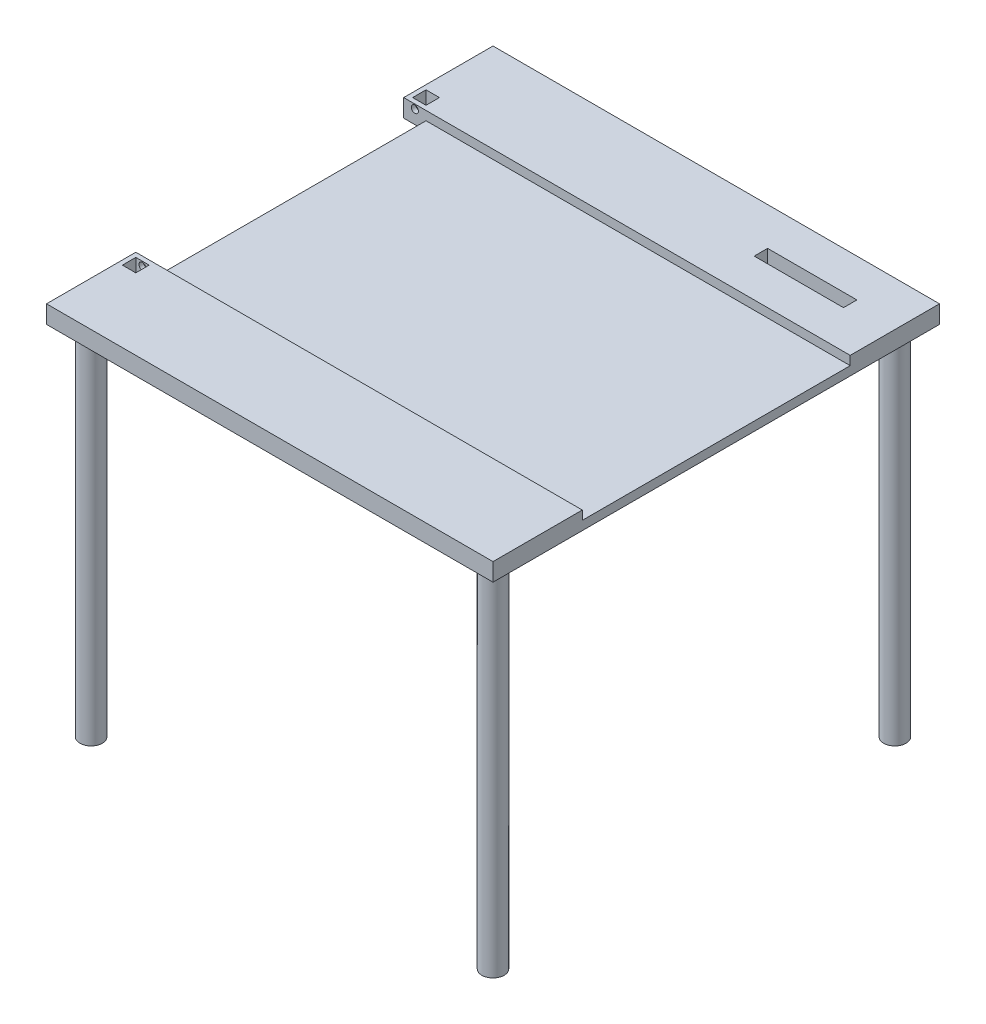
ISO-10303-21;
HEADER;
FILE_DESCRIPTION(('STEP AP214'),'2;1');
FILE_NAME('part.step','',(''),(''),'','','');
FILE_SCHEMA(('AUTOMOTIVE_DESIGN { 1 0 10303 214 1 1 1 1 }'));
ENDSEC;
DATA;
#1=APPLICATION_CONTEXT('core data for automotive mechanical design processes');
#2=APPLICATION_PROTOCOL_DEFINITION('international standard','automotive_design',2000,#1);
#3=PRODUCT_CONTEXT('',#1,'mechanical');
#4=PRODUCT('Part','Part','',(#3));
#5=PRODUCT_RELATED_PRODUCT_CATEGORY('part','',(#4));
#6=PRODUCT_DEFINITION_FORMATION('','',#4);
#7=PRODUCT_DEFINITION_CONTEXT('part definition',#1,'design');
#8=PRODUCT_DEFINITION('design','',#6,#7);
#9=PRODUCT_DEFINITION_SHAPE('','',#8);
#10=(LENGTH_UNIT() NAMED_UNIT(*) SI_UNIT(.MILLI.,.METRE.));
#11=(NAMED_UNIT(*) PLANE_ANGLE_UNIT() SI_UNIT($,.RADIAN.));
#12=(NAMED_UNIT(*) SI_UNIT($,.STERADIAN.) SOLID_ANGLE_UNIT());
#13=UNCERTAINTY_MEASURE_WITH_UNIT(LENGTH_MEASURE(1.E-05),#10,'distance_accuracy_value','');
#14=(GEOMETRIC_REPRESENTATION_CONTEXT(3) GLOBAL_UNCERTAINTY_ASSIGNED_CONTEXT((#13)) GLOBAL_UNIT_ASSIGNED_CONTEXT((#10,
#11,#12)) REPRESENTATION_CONTEXT('',''));
#15=CARTESIAN_POINT('',(0.,0.,0.));
#16=DIRECTION('',(0.,0.,1.));
#17=DIRECTION('',(1.,0.,0.));
#18=AXIS2_PLACEMENT_3D('',#15,#16,#17);
#19=CARTESIAN_POINT('',(0.,40.,0.));
#20=DIRECTION('',(0.,-1.,0.));
#21=DIRECTION('',(0.,0.,-1.));
#22=AXIS2_PLACEMENT_3D('',#19,#20,#21);
#23=PLANE('',#22);
#24=DIRECTION('',(0.,0.,1.));
#25=VECTOR('',#24,1.);
#26=CARTESIAN_POINT('',(2.22044604925031E-13,40.,1000.));
#27=LINE('',#26,#25);
#28=CARTESIAN_POINT('',(0.,40.,0.));
#29=VERTEX_POINT('',#28);
#30=CARTESIAN_POINT('',(0.,40.,200.));
#31=VERTEX_POINT('',#30);
#32=EDGE_CURVE('E333',#29,#31,#27,.T.);
#33=ORIENTED_EDGE('',*,*,#32,.T.);
#34=DIRECTION('',(-1.,0.,0.));
#35=VECTOR('',#34,1.);
#36=CARTESIAN_POINT('',(1000.,40.,200.));
#37=LINE('',#36,#35);
#38=CARTESIAN_POINT('',(1000.,40.,200.));
#39=VERTEX_POINT('',#38);
#40=EDGE_CURVE('E315',#39,#31,#37,.T.);
#41=ORIENTED_EDGE('',*,*,#40,.F.);
#42=DIRECTION('',(0.,0.,-1.));
#43=VECTOR('',#42,1.);
#44=CARTESIAN_POINT('',(1000.,40.,0.));
#45=LINE('',#44,#43);
#46=CARTESIAN_POINT('',(1000.,40.,0.));
#47=VERTEX_POINT('',#46);
#48=EDGE_CURVE('E339',#39,#47,#45,.T.);
#49=ORIENTED_EDGE('',*,*,#48,.T.);
#50=DIRECTION('',(-1.,0.,0.));
#51=VECTOR('',#50,1.);
#52=CARTESIAN_POINT('',(0.,40.,0.));
#53=LINE('',#52,#51);
#54=EDGE_CURVE('E343',#47,#29,#53,.T.);
#55=ORIENTED_EDGE('',*,*,#54,.T.);
#56=EDGE_LOOP('',(#33,#41,#49,#55));
#57=FACE_BOUND('',#56,.T.);
#58=DIRECTION('',(-1.,0.,0.));
#59=VECTOR('',#58,1.);
#60=CARTESIAN_POINT('',(0.,40.,160.));
#61=LINE('',#60,#59);
#62=CARTESIAN_POINT('',(40.,40.,160.));
#63=VERTEX_POINT('',#62);
#64=CARTESIAN_POINT('',(10.,40.,160.));
#65=VERTEX_POINT('',#64);
#66=EDGE_CURVE('E250',#63,#65,#61,.T.);
#67=ORIENTED_EDGE('',*,*,#66,.F.);
#68=DIRECTION('',(0.,0.,-1.));
#69=VECTOR('',#68,1.);
#70=CARTESIAN_POINT('',(40.,40.,0.));
#71=LINE('',#70,#69);
#72=CARTESIAN_POINT('',(40.,40.,190.));
#73=VERTEX_POINT('',#72);
#74=EDGE_CURVE('E64',#73,#63,#71,.T.);
#75=ORIENTED_EDGE('',*,*,#74,.F.);
#76=DIRECTION('',(1.,0.,0.));
#77=VECTOR('',#76,1.);
#78=CARTESIAN_POINT('',(0.,40.,190.));
#79=LINE('',#78,#77);
#80=CARTESIAN_POINT('',(10.,40.,190.));
#81=VERTEX_POINT('',#80);
#82=EDGE_CURVE('E257',#81,#73,#79,.T.);
#83=ORIENTED_EDGE('',*,*,#82,.F.);
#84=DIRECTION('',(0.,0.,1.));
#85=VECTOR('',#84,1.);
#86=CARTESIAN_POINT('',(10.,40.,0.));
#87=LINE('',#86,#85);
#88=EDGE_CURVE('E254',#65,#81,#87,.T.);
#89=ORIENTED_EDGE('',*,*,#88,.F.);
#90=EDGE_LOOP('',(#67,#75,#83,#89));
#91=FACE_BOUND('',#90,.T.);
#92=DIRECTION('',(0.,0.,-1.));
#93=VECTOR('',#92,1.);
#94=CARTESIAN_POINT('',(700.000000000003,40.,0.));
#95=LINE('',#94,#93);
#96=CARTESIAN_POINT('',(700.000000000003,40.,115.));
#97=VERTEX_POINT('',#96);
#98=CARTESIAN_POINT('',(700.000000000003,40.,85.0000000000002));
#99=VERTEX_POINT('',#98);
#100=EDGE_CURVE('E56',#97,#99,#95,.T.);
#101=ORIENTED_EDGE('',*,*,#100,.T.);
#102=DIRECTION('',(-1.,0.,0.));
#103=VECTOR('',#102,1.);
#104=CARTESIAN_POINT('',(0.,40.,85.0000000000002));
#105=LINE('',#104,#103);
#106=CARTESIAN_POINT('',(900.,40.,85.0000000000002));
#107=VERTEX_POINT('',#106);
#108=EDGE_CURVE('E206',#107,#99,#105,.T.);
#109=ORIENTED_EDGE('',*,*,#108,.F.);
#110=DIRECTION('',(0.,0.,-1.));
#111=VECTOR('',#110,1.);
#112=CARTESIAN_POINT('',(900.,40.,0.));
#113=LINE('',#112,#111);
#114=CARTESIAN_POINT('',(900.,40.,115.));
#115=VERTEX_POINT('',#114);
#116=EDGE_CURVE('E218',#115,#107,#113,.T.);
#117=ORIENTED_EDGE('',*,*,#116,.F.);
#118=DIRECTION('',(1.,0.,0.));
#119=VECTOR('',#118,1.);
#120=CARTESIAN_POINT('',(0.,40.,115.));
#121=LINE('',#120,#119);
#122=EDGE_CURVE('E216',#97,#115,#121,.T.);
#123=ORIENTED_EDGE('',*,*,#122,.F.);
#124=EDGE_LOOP('',(#101,#109,#117,#123));
#125=FACE_BOUND('',#124,.T.);
#126=ADVANCED_FACE('F39',(#57,#91,#125),#23,.F.);
#127=CARTESIAN_POINT('',(2.22044604925031E-13,40.,1000.));
#128=DIRECTION('',(1.,0.,0.));
#129=DIRECTION('',(0.,0.,-1.));
#130=AXIS2_PLACEMENT_3D('',#127,#128,#129);
#131=PLANE('',#130);
#132=DIRECTION('',(0.,0.,1.));
#133=VECTOR('',#132,1.);
#134=CARTESIAN_POINT('',(2.22044604925031E-13,0.,1000.));
#135=LINE('',#134,#133);
#136=CARTESIAN_POINT('',(0.,0.,0.));
#137=VERTEX_POINT('',#136);
#138=CARTESIAN_POINT('',(0.,0.,200.));
#139=VERTEX_POINT('',#138);
#140=EDGE_CURVE('E346',#137,#139,#135,.T.);
#141=ORIENTED_EDGE('',*,*,#140,.T.);
#142=DIRECTION('',(0.,1.,0.));
#143=VECTOR('',#142,1.);
#144=CARTESIAN_POINT('',(0.,20.,200.));
#145=LINE('',#144,#143);
#146=EDGE_CURVE('E323',#139,#31,#145,.T.);
#147=ORIENTED_EDGE('',*,*,#146,.T.);
#148=ORIENTED_EDGE('',*,*,#32,.F.);
#149=DIRECTION('',(0.,-1.,0.));
#150=VECTOR('',#149,1.);
#151=CARTESIAN_POINT('',(0.,40.,0.));
#152=LINE('',#151,#150);
#153=EDGE_CURVE('E345',#29,#137,#152,.T.);
#154=ORIENTED_EDGE('',*,*,#153,.T.);
#155=EDGE_LOOP('',(#141,#147,#148,#154));
#156=FACE_BOUND('',#155,.T.);
#157=ADVANCED_FACE('F404',(#156),#131,.F.);
#158=DIRECTION('',(0.,1.,0.));
#159=VECTOR('',#158,1.);
#160=CARTESIAN_POINT('',(0.,20.,800.));
#161=LINE('',#160,#159);
#162=CARTESIAN_POINT('',(0.,0.,800.));
#163=VERTEX_POINT('',#162);
#164=CARTESIAN_POINT('',(1.77635683940025E-13,40.,800.));
#165=VERTEX_POINT('',#164);
#166=EDGE_CURVE('E320',#163,#165,#161,.T.);
#167=ORIENTED_EDGE('',*,*,#166,.F.);
#168=CARTESIAN_POINT('',(2.22044604925031E-13,0.,1000.));
#169=VERTEX_POINT('',#168);
#170=EDGE_CURVE('E326',#163,#169,#135,.T.);
#171=ORIENTED_EDGE('',*,*,#170,.T.);
#172=DIRECTION('',(0.,-1.,0.));
#173=VECTOR('',#172,1.);
#174=CARTESIAN_POINT('',(2.22044604925031E-13,40.,1000.));
#175=LINE('',#174,#173);
#176=CARTESIAN_POINT('',(2.22044604925031E-13,40.,1000.));
#177=VERTEX_POINT('',#176);
#178=EDGE_CURVE('E363',#177,#169,#175,.T.);
#179=ORIENTED_EDGE('',*,*,#178,.F.);
#180=EDGE_CURVE('E337',#165,#177,#27,.T.);
#181=ORIENTED_EDGE('',*,*,#180,.F.);
#182=EDGE_LOOP('',(#167,#171,#179,#181));
#183=FACE_BOUND('',#182,.T.);
#184=ADVANCED_FACE('F41',(#183),#131,.F.);
#185=CARTESIAN_POINT('',(1000.,40.,1000.));
#186=DIRECTION('',(0.,0.,-1.));
#187=DIRECTION('',(-1.,0.,0.));
#188=AXIS2_PLACEMENT_3D('',#185,#186,#187);
#189=PLANE('',#188);
#190=DIRECTION('',(1.,0.,0.));
#191=VECTOR('',#190,1.);
#192=CARTESIAN_POINT('',(1000.,0.,1000.));
#193=LINE('',#192,#191);
#194=CARTESIAN_POINT('',(1000.,0.,1000.));
#195=VERTEX_POINT('',#194);
#196=EDGE_CURVE('E349',#169,#195,#193,.T.);
#197=ORIENTED_EDGE('',*,*,#196,.T.);
#198=DIRECTION('',(0.,-1.,0.));
#199=VECTOR('',#198,1.);
#200=CARTESIAN_POINT('',(1000.,40.,1000.));
#201=LINE('',#200,#199);
#202=CARTESIAN_POINT('',(1000.,40.,1000.));
#203=VERTEX_POINT('',#202);
#204=EDGE_CURVE('E360',#203,#195,#201,.T.);
#205=ORIENTED_EDGE('',*,*,#204,.F.);
#206=DIRECTION('',(1.,0.,0.));
#207=VECTOR('',#206,1.);
#208=CARTESIAN_POINT('',(1000.,40.,1000.));
#209=LINE('',#208,#207);
#210=EDGE_CURVE('E336',#177,#203,#209,.T.);
#211=ORIENTED_EDGE('',*,*,#210,.F.);
#212=ORIENTED_EDGE('',*,*,#178,.T.);
#213=EDGE_LOOP('',(#197,#205,#211,#212));
#214=FACE_BOUND('',#213,.T.);
#215=ADVANCED_FACE('F453',(#214),#189,.F.);
#216=CARTESIAN_POINT('',(1000.,40.,0.));
#217=DIRECTION('',(-1.,0.,0.));
#218=DIRECTION('',(0.,0.,1.));
#219=AXIS2_PLACEMENT_3D('',#216,#217,#218);
#220=PLANE('',#219);
#221=ORIENTED_EDGE('',*,*,#48,.F.);
#222=DIRECTION('',(0.,1.,0.));
#223=VECTOR('',#222,1.);
#224=CARTESIAN_POINT('',(1000.,20.,200.));
#225=LINE('',#224,#223);
#226=CARTESIAN_POINT('',(1000.,20.,200.));
#227=VERTEX_POINT('',#226);
#228=EDGE_CURVE('E327',#227,#39,#225,.T.);
#229=ORIENTED_EDGE('',*,*,#228,.F.);
#230=DIRECTION('',(0.,0.,-1.));
#231=VECTOR('',#230,1.);
#232=CARTESIAN_POINT('',(1000.,20.,800.));
#233=LINE('',#232,#231);
#234=CARTESIAN_POINT('',(1000.,20.,800.));
#235=VERTEX_POINT('',#234);
#236=EDGE_CURVE('E314',#235,#227,#233,.T.);
#237=ORIENTED_EDGE('',*,*,#236,.F.);
#238=DIRECTION('',(0.,1.,0.));
#239=VECTOR('',#238,1.);
#240=CARTESIAN_POINT('',(1000.,20.,800.));
#241=LINE('',#240,#239);
#242=CARTESIAN_POINT('',(1000.,40.,800.));
#243=VERTEX_POINT('',#242);
#244=EDGE_CURVE('E329',#235,#243,#241,.T.);
#245=ORIENTED_EDGE('',*,*,#244,.T.);
#246=EDGE_CURVE('E340',#203,#243,#45,.T.);
#247=ORIENTED_EDGE('',*,*,#246,.F.);
#248=ORIENTED_EDGE('',*,*,#204,.T.);
#249=DIRECTION('',(0.,0.,-1.));
#250=VECTOR('',#249,1.);
#251=CARTESIAN_POINT('',(1000.,0.,0.));
#252=LINE('',#251,#250);
#253=CARTESIAN_POINT('',(1000.,0.,0.));
#254=VERTEX_POINT('',#253);
#255=EDGE_CURVE('E351',#195,#254,#252,.T.);
#256=ORIENTED_EDGE('',*,*,#255,.T.);
#257=DIRECTION('',(0.,-1.,0.));
#258=VECTOR('',#257,1.);
#259=CARTESIAN_POINT('',(1000.,40.,0.));
#260=LINE('',#259,#258);
#261=EDGE_CURVE('E357',#47,#254,#260,.T.);
#262=ORIENTED_EDGE('',*,*,#261,.F.);
#263=EDGE_LOOP('',(#221,#229,#237,#245,#247,#248,#256,#262));
#264=FACE_BOUND('',#263,.T.);
#265=ADVANCED_FACE('F425',(#264),#220,.F.);
#266=CARTESIAN_POINT('',(0.,40.,0.));
#267=DIRECTION('',(0.,0.,1.));
#268=DIRECTION('',(1.,0.,0.));
#269=AXIS2_PLACEMENT_3D('',#266,#267,#268);
#270=PLANE('',#269);
#271=DIRECTION('',(-1.,0.,0.));
#272=VECTOR('',#271,1.);
#273=CARTESIAN_POINT('',(0.,0.,0.));
#274=LINE('',#273,#272);
#275=EDGE_CURVE('E353',#254,#137,#274,.T.);
#276=ORIENTED_EDGE('',*,*,#275,.T.);
#277=ORIENTED_EDGE('',*,*,#153,.F.);
#278=ORIENTED_EDGE('',*,*,#54,.F.);
#279=ORIENTED_EDGE('',*,*,#261,.T.);
#280=EDGE_LOOP('',(#276,#277,#278,#279));
#281=FACE_BOUND('',#280,.T.);
#282=ADVANCED_FACE('F417',(#281),#270,.F.);
#283=DIRECTION('',(-1.,0.,0.));
#284=VECTOR('',#283,1.);
#285=CARTESIAN_POINT('',(0.,40.,810.));
#286=LINE('',#285,#284);
#287=CARTESIAN_POINT('',(40.0000000000002,40.,810.));
#288=VERTEX_POINT('',#287);
#289=CARTESIAN_POINT('',(10.0000000000002,40.,810.));
#290=VERTEX_POINT('',#289);
#291=EDGE_CURVE('E271',#288,#290,#286,.T.);
#292=ORIENTED_EDGE('',*,*,#291,.F.);
#293=DIRECTION('',(0.,0.,-1.));
#294=VECTOR('',#293,1.);
#295=CARTESIAN_POINT('',(40.0000000000002,40.,0.));
#296=LINE('',#295,#294);
#297=CARTESIAN_POINT('',(40.0000000000002,40.,840.));
#298=VERTEX_POINT('',#297);
#299=EDGE_CURVE('E269',#298,#288,#296,.T.);
#300=ORIENTED_EDGE('',*,*,#299,.F.);
#301=DIRECTION('',(1.,0.,0.));
#302=VECTOR('',#301,1.);
#303=CARTESIAN_POINT('',(0.,40.,840.));
#304=LINE('',#303,#302);
#305=CARTESIAN_POINT('',(10.0000000000002,40.,840.));
#306=VERTEX_POINT('',#305);
#307=EDGE_CURVE('E277',#306,#298,#304,.T.);
#308=ORIENTED_EDGE('',*,*,#307,.F.);
#309=DIRECTION('',(0.,0.,1.));
#310=VECTOR('',#309,1.);
#311=CARTESIAN_POINT('',(10.0000000000001,40.,0.));
#312=LINE('',#311,#310);
#313=EDGE_CURVE('E274',#290,#306,#312,.T.);
#314=ORIENTED_EDGE('',*,*,#313,.F.);
#315=EDGE_LOOP('',(#292,#300,#308,#314));
#316=FACE_BOUND('',#315,.T.);
#317=ORIENTED_EDGE('',*,*,#246,.T.);
#318=DIRECTION('',(1.,0.,0.));
#319=VECTOR('',#318,1.);
#320=CARTESIAN_POINT('',(0.,40.,800.));
#321=LINE('',#320,#319);
#322=EDGE_CURVE('E309',#165,#243,#321,.T.);
#323=ORIENTED_EDGE('',*,*,#322,.F.);
#324=ORIENTED_EDGE('',*,*,#180,.T.);
#325=ORIENTED_EDGE('',*,*,#210,.T.);
#326=EDGE_LOOP('',(#317,#323,#324,#325));
#327=FACE_BOUND('',#326,.T.);
#328=ADVANCED_FACE('F407',(#316,#327),#23,.F.);
#329=CARTESIAN_POINT('',(0.,0.,0.));
#330=DIRECTION('',(0.,-1.,0.));
#331=DIRECTION('',(0.,0.,-1.));
#332=AXIS2_PLACEMENT_3D('',#329,#330,#331);
#333=PLANE('',#332);
#334=DIRECTION('',(1.,0.,0.));
#335=VECTOR('',#334,1.);
#336=CARTESIAN_POINT('',(0.,0.,200.));
#337=LINE('',#336,#335);
#338=CARTESIAN_POINT('',(50.,0.,200.));
#339=VERTEX_POINT('',#338);
#340=EDGE_CURVE('E240',#139,#339,#337,.T.);
#341=ORIENTED_EDGE('',*,*,#340,.F.);
#342=ORIENTED_EDGE('',*,*,#140,.F.);
#343=ORIENTED_EDGE('',*,*,#275,.F.);
#344=ORIENTED_EDGE('',*,*,#255,.F.);
#345=ORIENTED_EDGE('',*,*,#196,.F.);
#346=ORIENTED_EDGE('',*,*,#170,.F.);
#347=DIRECTION('',(-1.,0.,0.));
#348=VECTOR('',#347,1.);
#349=CARTESIAN_POINT('',(0.,0.,800.));
#350=LINE('',#349,#348);
#351=CARTESIAN_POINT('',(50.,0.,800.));
#352=VERTEX_POINT('',#351);
#353=EDGE_CURVE('E234',#352,#163,#350,.T.);
#354=ORIENTED_EDGE('',*,*,#353,.F.);
#355=DIRECTION('',(0.,0.,1.));
#356=VECTOR('',#355,1.);
#357=CARTESIAN_POINT('',(50.,0.,0.));
#358=LINE('',#357,#356);
#359=EDGE_CURVE('E238',#339,#352,#358,.T.);
#360=ORIENTED_EDGE('',*,*,#359,.F.);
#361=EDGE_LOOP('',(#341,#342,#343,#344,#345,#346,#354,#360));
#362=FACE_BOUND('',#361,.T.);
#363=DIRECTION('',(0.,0.,1.));
#364=VECTOR('',#363,1.);
#365=CARTESIAN_POINT('',(40.,0.,0.));
#366=LINE('',#365,#364);
#367=CARTESIAN_POINT('',(40.,0.,160.));
#368=VERTEX_POINT('',#367);
#369=CARTESIAN_POINT('',(40.,0.,190.));
#370=VERTEX_POINT('',#369);
#371=EDGE_CURVE('E11',#368,#370,#366,.T.);
#372=ORIENTED_EDGE('',*,*,#371,.F.);
#373=DIRECTION('',(1.,0.,0.));
#374=VECTOR('',#373,1.);
#375=CARTESIAN_POINT('',(0.,0.,160.));
#376=LINE('',#375,#374);
#377=CARTESIAN_POINT('',(10.,0.,160.));
#378=VERTEX_POINT('',#377);
#379=EDGE_CURVE('E375',#378,#368,#376,.T.);
#380=ORIENTED_EDGE('',*,*,#379,.F.);
#381=DIRECTION('',(0.,0.,-1.));
#382=VECTOR('',#381,1.);
#383=CARTESIAN_POINT('',(10.,0.,0.));
#384=LINE('',#383,#382);
#385=CARTESIAN_POINT('',(10.,0.,190.));
#386=VERTEX_POINT('',#385);
#387=EDGE_CURVE('E377',#386,#378,#384,.T.);
#388=ORIENTED_EDGE('',*,*,#387,.F.);
#389=DIRECTION('',(-1.,0.,0.));
#390=VECTOR('',#389,1.);
#391=CARTESIAN_POINT('',(0.,0.,190.));
#392=LINE('',#391,#390);
#393=EDGE_CURVE('E48',#370,#386,#392,.T.);
#394=ORIENTED_EDGE('',*,*,#393,.F.);
#395=EDGE_LOOP('',(#372,#380,#388,#394));
#396=FACE_BOUND('',#395,.T.);
#397=DIRECTION('',(0.,0.,1.));
#398=VECTOR('',#397,1.);
#399=CARTESIAN_POINT('',(40.0000000000002,0.,0.));
#400=LINE('',#399,#398);
#401=CARTESIAN_POINT('',(40.0000000000002,0.,810.));
#402=VERTEX_POINT('',#401);
#403=CARTESIAN_POINT('',(40.0000000000002,0.,840.));
#404=VERTEX_POINT('',#403);
#405=EDGE_CURVE('E373',#402,#404,#400,.T.);
#406=ORIENTED_EDGE('',*,*,#405,.F.);
#407=DIRECTION('',(1.,0.,0.));
#408=VECTOR('',#407,1.);
#409=CARTESIAN_POINT('',(0.,0.,810.));
#410=LINE('',#409,#408);
#411=CARTESIAN_POINT('',(10.0000000000002,0.,810.));
#412=VERTEX_POINT('',#411);
#413=EDGE_CURVE('E366',#412,#402,#410,.T.);
#414=ORIENTED_EDGE('',*,*,#413,.F.);
#415=DIRECTION('',(0.,0.,-1.));
#416=VECTOR('',#415,1.);
#417=CARTESIAN_POINT('',(10.0000000000001,0.,0.));
#418=LINE('',#417,#416);
#419=CARTESIAN_POINT('',(10.0000000000002,0.,840.));
#420=VERTEX_POINT('',#419);
#421=EDGE_CURVE('E368',#420,#412,#418,.T.);
#422=ORIENTED_EDGE('',*,*,#421,.F.);
#423=DIRECTION('',(-1.,0.,0.));
#424=VECTOR('',#423,1.);
#425=CARTESIAN_POINT('',(0.,0.,840.));
#426=LINE('',#425,#424);
#427=EDGE_CURVE('E371',#404,#420,#426,.T.);
#428=ORIENTED_EDGE('',*,*,#427,.F.);
#429=EDGE_LOOP('',(#406,#414,#422,#428));
#430=FACE_BOUND('',#429,.T.);
#431=CARTESIAN_POINT('',(50.0000000000003,0.,50.0000000000003));
#432=DIRECTION('',(0.,-1.,0.));
#433=DIRECTION('',(0.,0.,-1.));
#434=AXIS2_PLACEMENT_3D('',#431,#432,#433);
#435=CIRCLE('',#434,25.);
#436=CARTESIAN_POINT('',(50.0000000000003,0.,25.0000000000003));
#437=VERTEX_POINT('',#436);
#438=EDGE_CURVE('E288',#437,#437,#435,.T.);
#439=ORIENTED_EDGE('',*,*,#438,.F.);
#440=EDGE_LOOP('',(#439));
#441=FACE_BOUND('',#440,.T.);
#442=CARTESIAN_POINT('',(950.,0.,50.0000000000003));
#443=DIRECTION('',(0.,-1.,0.));
#444=DIRECTION('',(0.,0.,-1.));
#445=AXIS2_PLACEMENT_3D('',#442,#443,#444);
#446=CIRCLE('',#445,25.);
#447=CARTESIAN_POINT('',(950.,0.,25.0000000000003));
#448=VERTEX_POINT('',#447);
#449=EDGE_CURVE('E294',#448,#448,#446,.T.);
#450=ORIENTED_EDGE('',*,*,#449,.F.);
#451=EDGE_LOOP('',(#450));
#452=FACE_BOUND('',#451,.T.);
#453=CARTESIAN_POINT('',(950.,0.,950.));
#454=DIRECTION('',(0.,-1.,0.));
#455=DIRECTION('',(0.,0.,-1.));
#456=AXIS2_PLACEMENT_3D('',#453,#454,#455);
#457=CIRCLE('',#456,25.);
#458=CARTESIAN_POINT('',(950.,0.,925.));
#459=VERTEX_POINT('',#458);
#460=EDGE_CURVE('E300',#459,#459,#457,.T.);
#461=ORIENTED_EDGE('',*,*,#460,.F.);
#462=EDGE_LOOP('',(#461));
#463=FACE_BOUND('',#462,.T.);
#464=CARTESIAN_POINT('',(50.0000000000002,0.,950.));
#465=DIRECTION('',(0.,-1.,0.));
#466=DIRECTION('',(0.,0.,-1.));
#467=AXIS2_PLACEMENT_3D('',#464,#465,#466);
#468=CIRCLE('',#467,25.);
#469=CARTESIAN_POINT('',(50.0000000000002,0.,925.));
#470=VERTEX_POINT('',#469);
#471=EDGE_CURVE('E303',#470,#470,#468,.T.);
#472=ORIENTED_EDGE('',*,*,#471,.F.);
#473=EDGE_LOOP('',(#472));
#474=FACE_BOUND('',#473,.T.);
#475=ADVANCED_FACE('F416',(#362,#396,#430,#441,#452,#463,#474),#333,.T.);
#476=CARTESIAN_POINT('',(1000.,20.,200.));
#477=DIRECTION('',(0.,0.,-1.));
#478=DIRECTION('',(-1.,0.,0.));
#479=AXIS2_PLACEMENT_3D('',#476,#477,#478);
#480=PLANE('',#479);
#481=CARTESIAN_POINT('',(25.0000000000002,30.,200.));
#482=DIRECTION('',(0.,0.,1.));
#483=DIRECTION('',(1.,0.,0.));
#484=AXIS2_PLACEMENT_3D('',#481,#482,#483);
#485=CIRCLE('',#484,8.);
#486=CARTESIAN_POINT('',(33.0000000000002,30.,200.));
#487=VERTEX_POINT('',#486);
#488=EDGE_CURVE('E245',#487,#487,#485,.T.);
#489=ORIENTED_EDGE('',*,*,#488,.F.);
#490=EDGE_LOOP('',(#489));
#491=FACE_BOUND('',#490,.T.);
#492=ORIENTED_EDGE('',*,*,#40,.T.);
#493=ORIENTED_EDGE('',*,*,#146,.F.);
#494=ORIENTED_EDGE('',*,*,#340,.T.);
#495=DIRECTION('',(0.,1.,0.));
#496=VECTOR('',#495,1.);
#497=CARTESIAN_POINT('',(50.,-10.,200.));
#498=LINE('',#497,#496);
#499=CARTESIAN_POINT('',(50.,20.,200.));
#500=VERTEX_POINT('',#499);
#501=EDGE_CURVE('E232',#339,#500,#498,.T.);
#502=ORIENTED_EDGE('',*,*,#501,.T.);
#503=DIRECTION('',(-1.,0.,0.));
#504=VECTOR('',#503,1.);
#505=CARTESIAN_POINT('',(1000.,20.,200.));
#506=LINE('',#505,#504);
#507=EDGE_CURVE('E317',#227,#500,#506,.T.);
#508=ORIENTED_EDGE('',*,*,#507,.F.);
#509=ORIENTED_EDGE('',*,*,#228,.T.);
#510=EDGE_LOOP('',(#492,#493,#494,#502,#508,#509));
#511=FACE_BOUND('',#510,.T.);
#512=ADVANCED_FACE('F423',(#491,#511),#480,.F.);
#513=CARTESIAN_POINT('',(0.,20.,800.));
#514=DIRECTION('',(0.,0.,1.));
#515=DIRECTION('',(1.,0.,0.));
#516=AXIS2_PLACEMENT_3D('',#513,#514,#515);
#517=PLANE('',#516);
#518=CARTESIAN_POINT('',(25.,30.,800.));
#519=DIRECTION('',(0.,0.,-1.));
#520=DIRECTION('',(-1.,0.,0.));
#521=AXIS2_PLACEMENT_3D('',#518,#519,#520);
#522=CIRCLE('',#521,8.);
#523=CARTESIAN_POINT('',(17.,30.,800.));
#524=VERTEX_POINT('',#523);
#525=EDGE_CURVE('E242',#524,#524,#522,.T.);
#526=ORIENTED_EDGE('',*,*,#525,.F.);
#527=EDGE_LOOP('',(#526));
#528=FACE_BOUND('',#527,.T.);
#529=ORIENTED_EDGE('',*,*,#322,.T.);
#530=ORIENTED_EDGE('',*,*,#244,.F.);
#531=DIRECTION('',(1.,0.,0.));
#532=VECTOR('',#531,1.);
#533=CARTESIAN_POINT('',(0.,20.,800.));
#534=LINE('',#533,#532);
#535=CARTESIAN_POINT('',(50.,20.,800.));
#536=VERTEX_POINT('',#535);
#537=EDGE_CURVE('E312',#536,#235,#534,.T.);
#538=ORIENTED_EDGE('',*,*,#537,.F.);
#539=DIRECTION('',(0.,1.,0.));
#540=VECTOR('',#539,1.);
#541=CARTESIAN_POINT('',(50.,-10.,800.));
#542=LINE('',#541,#540);
#543=EDGE_CURVE('E231',#352,#536,#542,.T.);
#544=ORIENTED_EDGE('',*,*,#543,.F.);
#545=ORIENTED_EDGE('',*,*,#353,.T.);
#546=ORIENTED_EDGE('',*,*,#166,.T.);
#547=EDGE_LOOP('',(#529,#530,#538,#544,#545,#546));
#548=FACE_BOUND('',#547,.T.);
#549=ADVANCED_FACE('F445',(#528,#548),#517,.F.);
#550=CARTESIAN_POINT('',(0.,20.,0.));
#551=DIRECTION('',(0.,1.,0.));
#552=DIRECTION('',(0.,0.,1.));
#553=AXIS2_PLACEMENT_3D('',#550,#551,#552);
#554=PLANE('',#553);
#555=DIRECTION('',(0.,0.,-1.));
#556=VECTOR('',#555,1.);
#557=CARTESIAN_POINT('',(50.,20.,200.));
#558=LINE('',#557,#556);
#559=EDGE_CURVE('E225',#536,#500,#558,.T.);
#560=ORIENTED_EDGE('',*,*,#559,.F.);
#561=ORIENTED_EDGE('',*,*,#537,.T.);
#562=ORIENTED_EDGE('',*,*,#236,.T.);
#563=ORIENTED_EDGE('',*,*,#507,.T.);
#564=EDGE_LOOP('',(#560,#561,#562,#563));
#565=FACE_BOUND('',#564,.T.);
#566=ADVANCED_FACE('F468',(#565),#554,.T.);
#567=CARTESIAN_POINT('',(50.0000000000002,-800.,950.));
#568=DIRECTION('',(0.,1.,0.));
#569=DIRECTION('',(0.,0.,1.));
#570=AXIS2_PLACEMENT_3D('',#567,#568,#569);
#571=CYLINDRICAL_SURFACE('',#570,25.);
#572=CARTESIAN_POINT('',(50.0000000000002,-800.,950.));
#573=DIRECTION('',(0.,-1.,0.));
#574=DIRECTION('',(0.,0.,-1.));
#575=AXIS2_PLACEMENT_3D('',#572,#573,#574);
#576=CIRCLE('',#575,25.);
#577=CARTESIAN_POINT('',(50.0000000000002,-800.,925.));
#578=VERTEX_POINT('',#577);
#579=EDGE_CURVE('E306',#578,#578,#576,.T.);
#580=ORIENTED_EDGE('',*,*,#579,.F.);
#581=EDGE_LOOP('',(#580));
#582=FACE_BOUND('',#581,.T.);
#583=ORIENTED_EDGE('',*,*,#471,.T.);
#584=EDGE_LOOP('',(#583));
#585=FACE_BOUND('',#584,.T.);
#586=ADVANCED_FACE('F525',(#582,#585),#571,.T.);
#587=CARTESIAN_POINT('',(50.0000000000002,-800.,950.));
#588=DIRECTION('',(0.,-1.,0.));
#589=DIRECTION('',(0.,0.,-1.));
#590=AXIS2_PLACEMENT_3D('',#587,#588,#589);
#591=PLANE('',#590);
#592=ORIENTED_EDGE('',*,*,#579,.T.);
#593=EDGE_LOOP('',(#592));
#594=FACE_BOUND('',#593,.T.);
#595=ADVANCED_FACE('F712',(#594),#591,.T.);
#596=CARTESIAN_POINT('',(950.,-800.,950.));
#597=DIRECTION('',(0.,1.,0.));
#598=DIRECTION('',(0.,0.,1.));
#599=AXIS2_PLACEMENT_3D('',#596,#597,#598);
#600=CYLINDRICAL_SURFACE('',#599,25.);
#601=CARTESIAN_POINT('',(950.,-800.,950.));
#602=DIRECTION('',(0.,-1.,0.));
#603=DIRECTION('',(0.,0.,-1.));
#604=AXIS2_PLACEMENT_3D('',#601,#602,#603);
#605=CIRCLE('',#604,25.);
#606=CARTESIAN_POINT('',(950.,-800.,925.));
#607=VERTEX_POINT('',#606);
#608=EDGE_CURVE('E297',#607,#607,#605,.T.);
#609=ORIENTED_EDGE('',*,*,#608,.F.);
#610=EDGE_LOOP('',(#609));
#611=FACE_BOUND('',#610,.T.);
#612=ORIENTED_EDGE('',*,*,#460,.T.);
#613=EDGE_LOOP('',(#612));
#614=FACE_BOUND('',#613,.T.);
#615=ADVANCED_FACE('F702',(#611,#614),#600,.T.);
#616=CARTESIAN_POINT('',(950.,-800.,950.));
#617=DIRECTION('',(0.,-1.,0.));
#618=DIRECTION('',(0.,0.,-1.));
#619=AXIS2_PLACEMENT_3D('',#616,#617,#618);
#620=PLANE('',#619);
#621=ORIENTED_EDGE('',*,*,#608,.T.);
#622=EDGE_LOOP('',(#621));
#623=FACE_BOUND('',#622,.T.);
#624=ADVANCED_FACE('F692',(#623),#620,.T.);
#625=CARTESIAN_POINT('',(950.,-800.,50.0000000000003));
#626=DIRECTION('',(0.,1.,0.));
#627=DIRECTION('',(0.,0.,1.));
#628=AXIS2_PLACEMENT_3D('',#625,#626,#627);
#629=CYLINDRICAL_SURFACE('',#628,25.);
#630=CARTESIAN_POINT('',(950.,-800.,50.0000000000003));
#631=DIRECTION('',(0.,-1.,0.));
#632=DIRECTION('',(0.,0.,-1.));
#633=AXIS2_PLACEMENT_3D('',#630,#631,#632);
#634=CIRCLE('',#633,25.);
#635=CARTESIAN_POINT('',(950.,-800.,25.0000000000003));
#636=VERTEX_POINT('',#635);
#637=EDGE_CURVE('E291',#636,#636,#634,.T.);
#638=ORIENTED_EDGE('',*,*,#637,.F.);
#639=EDGE_LOOP('',(#638));
#640=FACE_BOUND('',#639,.T.);
#641=ORIENTED_EDGE('',*,*,#449,.T.);
#642=EDGE_LOOP('',(#641));
#643=FACE_BOUND('',#642,.T.);
#644=ADVANCED_FACE('F682',(#640,#643),#629,.T.);
#645=CARTESIAN_POINT('',(950.,-800.,50.0000000000003));
#646=DIRECTION('',(0.,-1.,0.));
#647=DIRECTION('',(0.,0.,-1.));
#648=AXIS2_PLACEMENT_3D('',#645,#646,#647);
#649=PLANE('',#648);
#650=ORIENTED_EDGE('',*,*,#637,.T.);
#651=EDGE_LOOP('',(#650));
#652=FACE_BOUND('',#651,.T.);
#653=ADVANCED_FACE('F672',(#652),#649,.T.);
#654=CARTESIAN_POINT('',(50.0000000000003,-800.,50.0000000000003));
#655=DIRECTION('',(0.,1.,0.));
#656=DIRECTION('',(0.,0.,1.));
#657=AXIS2_PLACEMENT_3D('',#654,#655,#656);
#658=CYLINDRICAL_SURFACE('',#657,25.);
#659=CARTESIAN_POINT('',(50.0000000000003,-800.,50.0000000000003));
#660=DIRECTION('',(0.,-1.,0.));
#661=DIRECTION('',(0.,0.,-1.));
#662=AXIS2_PLACEMENT_3D('',#659,#660,#661);
#663=CIRCLE('',#662,25.);
#664=CARTESIAN_POINT('',(50.0000000000003,-800.,25.0000000000003));
#665=VERTEX_POINT('',#664);
#666=EDGE_CURVE('E263',#665,#665,#663,.T.);
#667=ORIENTED_EDGE('',*,*,#666,.F.);
#668=EDGE_LOOP('',(#667));
#669=FACE_BOUND('',#668,.T.);
#670=ORIENTED_EDGE('',*,*,#438,.T.);
#671=EDGE_LOOP('',(#670));
#672=FACE_BOUND('',#671,.T.);
#673=ADVANCED_FACE('F662',(#669,#672),#658,.T.);
#674=CARTESIAN_POINT('',(50.0000000000003,-800.,50.0000000000003));
#675=DIRECTION('',(0.,-1.,0.));
#676=DIRECTION('',(0.,0.,-1.));
#677=AXIS2_PLACEMENT_3D('',#674,#675,#676);
#678=PLANE('',#677);
#679=ORIENTED_EDGE('',*,*,#666,.T.);
#680=EDGE_LOOP('',(#679));
#681=FACE_BOUND('',#680,.T.);
#682=ADVANCED_FACE('F647',(#681),#678,.T.);
#683=CARTESIAN_POINT('',(40.0000000000002,-10.,0.));
#684=DIRECTION('',(1.,0.,0.));
#685=DIRECTION('',(0.,0.,-1.));
#686=AXIS2_PLACEMENT_3D('',#683,#684,#685);
#687=PLANE('',#686);
#688=ORIENTED_EDGE('',*,*,#405,.T.);
#689=DIRECTION('',(0.,1.,0.));
#690=VECTOR('',#689,1.);
#691=CARTESIAN_POINT('',(40.0000000000002,-10.,840.));
#692=LINE('',#691,#690);
#693=EDGE_CURVE('E251',#404,#298,#692,.T.);
#694=ORIENTED_EDGE('',*,*,#693,.T.);
#695=ORIENTED_EDGE('',*,*,#299,.T.);
#696=DIRECTION('',(0.,1.,0.));
#697=VECTOR('',#696,1.);
#698=CARTESIAN_POINT('',(40.0000000000002,-10.,810.));
#699=LINE('',#698,#697);
#700=EDGE_CURVE('E280',#402,#288,#699,.T.);
#701=ORIENTED_EDGE('',*,*,#700,.F.);
#702=EDGE_LOOP('',(#688,#694,#695,#701));
#703=FACE_BOUND('',#702,.T.);
#704=ADVANCED_FACE('F638',(#703),#687,.F.);
#705=CARTESIAN_POINT('',(0.,-10.,840.));
#706=DIRECTION('',(0.,0.,1.));
#707=DIRECTION('',(1.,0.,0.));
#708=AXIS2_PLACEMENT_3D('',#705,#706,#707);
#709=PLANE('',#708);
#710=ORIENTED_EDGE('',*,*,#427,.T.);
#711=DIRECTION('',(0.,1.,0.));
#712=VECTOR('',#711,1.);
#713=CARTESIAN_POINT('',(10.0000000000002,-10.,840.));
#714=LINE('',#713,#712);
#715=EDGE_CURVE('E282',#420,#306,#714,.T.);
#716=ORIENTED_EDGE('',*,*,#715,.T.);
#717=ORIENTED_EDGE('',*,*,#307,.T.);
#718=ORIENTED_EDGE('',*,*,#693,.F.);
#719=EDGE_LOOP('',(#710,#716,#717,#718));
#720=FACE_BOUND('',#719,.T.);
#721=ADVANCED_FACE('F628',(#720),#709,.F.);
#722=CARTESIAN_POINT('',(10.0000000000001,-10.,0.));
#723=DIRECTION('',(-1.,0.,0.));
#724=DIRECTION('',(0.,0.,1.));
#725=AXIS2_PLACEMENT_3D('',#722,#723,#724);
#726=PLANE('',#725);
#727=ORIENTED_EDGE('',*,*,#421,.T.);
#728=DIRECTION('',(0.,1.,0.));
#729=VECTOR('',#728,1.);
#730=CARTESIAN_POINT('',(10.0000000000002,-10.,810.));
#731=LINE('',#730,#729);
#732=EDGE_CURVE('E284',#412,#290,#731,.T.);
#733=ORIENTED_EDGE('',*,*,#732,.T.);
#734=ORIENTED_EDGE('',*,*,#313,.T.);
#735=ORIENTED_EDGE('',*,*,#715,.F.);
#736=EDGE_LOOP('',(#727,#733,#734,#735));
#737=FACE_BOUND('',#736,.T.);
#738=ADVANCED_FACE('F584',(#737),#726,.F.);
#739=CARTESIAN_POINT('',(0.,-10.,810.));
#740=DIRECTION('',(0.,0.,-1.));
#741=DIRECTION('',(-1.,0.,0.));
#742=AXIS2_PLACEMENT_3D('',#739,#740,#741);
#743=PLANE('',#742);
#744=CARTESIAN_POINT('',(25.,30.,810.));
#745=DIRECTION('',(0.,0.,-1.));
#746=DIRECTION('',(-1.,0.,0.));
#747=AXIS2_PLACEMENT_3D('',#744,#745,#746);
#748=CIRCLE('',#747,8.);
#749=CARTESIAN_POINT('',(17.,30.,810.));
#750=VERTEX_POINT('',#749);
#751=EDGE_CURVE('E43',#750,#750,#748,.T.);
#752=ORIENTED_EDGE('',*,*,#751,.T.);
#753=EDGE_LOOP('',(#752));
#754=FACE_BOUND('',#753,.T.);
#755=ORIENTED_EDGE('',*,*,#413,.T.);
#756=ORIENTED_EDGE('',*,*,#700,.T.);
#757=ORIENTED_EDGE('',*,*,#291,.T.);
#758=ORIENTED_EDGE('',*,*,#732,.F.);
#759=EDGE_LOOP('',(#755,#756,#757,#758));
#760=FACE_BOUND('',#759,.T.);
#761=ADVANCED_FACE('F579',(#754,#760),#743,.F.);
#762=CARTESIAN_POINT('',(40.,-10.,0.));
#763=DIRECTION('',(1.,0.,0.));
#764=DIRECTION('',(0.,0.,-1.));
#765=AXIS2_PLACEMENT_3D('',#762,#763,#764);
#766=PLANE('',#765);
#767=ORIENTED_EDGE('',*,*,#371,.T.);
#768=DIRECTION('',(0.,1.,0.));
#769=VECTOR('',#768,1.);
#770=CARTESIAN_POINT('',(40.,-10.,190.));
#771=LINE('',#770,#769);
#772=EDGE_CURVE('E261',#370,#73,#771,.T.);
#773=ORIENTED_EDGE('',*,*,#772,.T.);
#774=ORIENTED_EDGE('',*,*,#74,.T.);
#775=DIRECTION('',(0.,1.,0.));
#776=VECTOR('',#775,1.);
#777=CARTESIAN_POINT('',(40.,-10.,160.));
#778=LINE('',#777,#776);
#779=EDGE_CURVE('E260',#368,#63,#778,.T.);
#780=ORIENTED_EDGE('',*,*,#779,.F.);
#781=EDGE_LOOP('',(#767,#773,#774,#780));
#782=FACE_BOUND('',#781,.T.);
#783=ADVANCED_FACE('F583',(#782),#766,.F.);
#784=CARTESIAN_POINT('',(0.,-10.,190.));
#785=DIRECTION('',(0.,0.,1.));
#786=DIRECTION('',(1.,0.,0.));
#787=AXIS2_PLACEMENT_3D('',#784,#785,#786);
#788=PLANE('',#787);
#789=CARTESIAN_POINT('',(25.0000000000002,30.,190.));
#790=DIRECTION('',(0.,0.,1.));
#791=DIRECTION('',(1.,0.,0.));
#792=AXIS2_PLACEMENT_3D('',#789,#790,#791);
#793=CIRCLE('',#792,8.);
#794=CARTESIAN_POINT('',(33.0000000000002,30.,190.));
#795=VERTEX_POINT('',#794);
#796=EDGE_CURVE('E248',#795,#795,#793,.T.);
#797=ORIENTED_EDGE('',*,*,#796,.T.);
#798=EDGE_LOOP('',(#797));
#799=FACE_BOUND('',#798,.T.);
#800=ORIENTED_EDGE('',*,*,#393,.T.);
#801=DIRECTION('',(0.,1.,0.));
#802=VECTOR('',#801,1.);
#803=CARTESIAN_POINT('',(10.,-10.,190.));
#804=LINE('',#803,#802);
#805=EDGE_CURVE('E264',#386,#81,#804,.T.);
#806=ORIENTED_EDGE('',*,*,#805,.T.);
#807=ORIENTED_EDGE('',*,*,#82,.T.);
#808=ORIENTED_EDGE('',*,*,#772,.F.);
#809=EDGE_LOOP('',(#800,#806,#807,#808));
#810=FACE_BOUND('',#809,.T.);
#811=ADVANCED_FACE('F383',(#799,#810),#788,.F.);
#812=CARTESIAN_POINT('',(10.,-10.,0.));
#813=DIRECTION('',(-1.,0.,0.));
#814=DIRECTION('',(0.,0.,1.));
#815=AXIS2_PLACEMENT_3D('',#812,#813,#814);
#816=PLANE('',#815);
#817=ORIENTED_EDGE('',*,*,#387,.T.);
#818=DIRECTION('',(0.,1.,0.));
#819=VECTOR('',#818,1.);
#820=CARTESIAN_POINT('',(10.,-10.,160.));
#821=LINE('',#820,#819);
#822=EDGE_CURVE('E266',#378,#65,#821,.T.);
#823=ORIENTED_EDGE('',*,*,#822,.T.);
#824=ORIENTED_EDGE('',*,*,#88,.T.);
#825=ORIENTED_EDGE('',*,*,#805,.F.);
#826=EDGE_LOOP('',(#817,#823,#824,#825));
#827=FACE_BOUND('',#826,.T.);
#828=ADVANCED_FACE('F399',(#827),#816,.F.);
#829=CARTESIAN_POINT('',(0.,-10.,160.));
#830=DIRECTION('',(0.,0.,-1.));
#831=DIRECTION('',(-1.,0.,0.));
#832=AXIS2_PLACEMENT_3D('',#829,#830,#831);
#833=PLANE('',#832);
#834=ORIENTED_EDGE('',*,*,#379,.T.);
#835=ORIENTED_EDGE('',*,*,#779,.T.);
#836=ORIENTED_EDGE('',*,*,#66,.T.);
#837=ORIENTED_EDGE('',*,*,#822,.F.);
#838=EDGE_LOOP('',(#834,#835,#836,#837));
#839=FACE_BOUND('',#838,.T.);
#840=ADVANCED_FACE('F389',(#839),#833,.F.);
#841=CARTESIAN_POINT('',(25.0000000000002,30.,170.));
#842=DIRECTION('',(0.,0.,1.));
#843=DIRECTION('',(1.,0.,0.));
#844=AXIS2_PLACEMENT_3D('',#841,#842,#843);
#845=CYLINDRICAL_SURFACE('',#844,8.);
#846=ORIENTED_EDGE('',*,*,#488,.T.);
#847=EDGE_LOOP('',(#846));
#848=FACE_BOUND('',#847,.T.);
#849=ORIENTED_EDGE('',*,*,#796,.F.);
#850=EDGE_LOOP('',(#849));
#851=FACE_BOUND('',#850,.T.);
#852=ADVANCED_FACE('F386',(#848,#851),#845,.F.);
#853=CARTESIAN_POINT('',(25.,30.,830.));
#854=DIRECTION('',(0.,0.,-1.));
#855=DIRECTION('',(-1.,0.,0.));
#856=AXIS2_PLACEMENT_3D('',#853,#854,#855);
#857=CYLINDRICAL_SURFACE('',#856,8.);
#858=ORIENTED_EDGE('',*,*,#525,.T.);
#859=EDGE_LOOP('',(#858));
#860=FACE_BOUND('',#859,.T.);
#861=ORIENTED_EDGE('',*,*,#751,.F.);
#862=EDGE_LOOP('',(#861));
#863=FACE_BOUND('',#862,.T.);
#864=ADVANCED_FACE('F388',(#860,#863),#857,.F.);
#865=CARTESIAN_POINT('',(50.,-10.,200.));
#866=DIRECTION('',(1.,0.,0.));
#867=DIRECTION('',(0.,0.,-1.));
#868=AXIS2_PLACEMENT_3D('',#865,#866,#867);
#869=PLANE('',#868);
#870=ORIENTED_EDGE('',*,*,#359,.T.);
#871=ORIENTED_EDGE('',*,*,#543,.T.);
#872=ORIENTED_EDGE('',*,*,#559,.T.);
#873=ORIENTED_EDGE('',*,*,#501,.F.);
#874=EDGE_LOOP('',(#870,#871,#872,#873));
#875=FACE_BOUND('',#874,.T.);
#876=ADVANCED_FACE('F396',(#875),#869,.F.);
#877=CARTESIAN_POINT('',(700.000000000003,10.,0.));
#878=DIRECTION('',(1.,0.,0.));
#879=DIRECTION('',(0.,0.,-1.));
#880=AXIS2_PLACEMENT_3D('',#877,#878,#879);
#881=PLANE('',#880);
#882=ORIENTED_EDGE('',*,*,#100,.F.);
#883=DIRECTION('',(0.,1.,0.));
#884=VECTOR('',#883,1.);
#885=CARTESIAN_POINT('',(700.000000000003,10.,115.));
#886=LINE('',#885,#884);
#887=CARTESIAN_POINT('',(700.000000000003,10.,115.));
#888=VERTEX_POINT('',#887);
#889=EDGE_CURVE('E187',#888,#97,#886,.T.);
#890=ORIENTED_EDGE('',*,*,#889,.F.);
#891=DIRECTION('',(0.,0.,-1.));
#892=VECTOR('',#891,1.);
#893=CARTESIAN_POINT('',(700.000000000003,10.,0.));
#894=LINE('',#893,#892);
#895=CARTESIAN_POINT('',(700.000000000003,10.,85.0000000000002));
#896=VERTEX_POINT('',#895);
#897=EDGE_CURVE('E190',#888,#896,#894,.T.);
#898=ORIENTED_EDGE('',*,*,#897,.T.);
#899=DIRECTION('',(0.,1.,0.));
#900=VECTOR('',#899,1.);
#901=CARTESIAN_POINT('',(700.000000000003,10.,85.0000000000002));
#902=LINE('',#901,#900);
#903=EDGE_CURVE('E223',#896,#99,#902,.T.);
#904=ORIENTED_EDGE('',*,*,#903,.T.);
#905=EDGE_LOOP('',(#882,#890,#898,#904));
#906=FACE_BOUND('',#905,.T.);
#907=ADVANCED_FACE('F189',(#906),#881,.T.);
#908=CARTESIAN_POINT('',(0.,10.,85.0000000000002));
#909=DIRECTION('',(0.,0.,-1.));
#910=DIRECTION('',(-1.,0.,0.));
#911=AXIS2_PLACEMENT_3D('',#908,#909,#910);
#912=PLANE('',#911);
#913=ORIENTED_EDGE('',*,*,#108,.T.);
#914=ORIENTED_EDGE('',*,*,#903,.F.);
#915=DIRECTION('',(-1.,0.,0.));
#916=VECTOR('',#915,1.);
#917=CARTESIAN_POINT('',(0.,10.,85.0000000000002));
#918=LINE('',#917,#916);
#919=CARTESIAN_POINT('',(900.,10.,85.0000000000002));
#920=VERTEX_POINT('',#919);
#921=EDGE_CURVE('E197',#920,#896,#918,.T.);
#922=ORIENTED_EDGE('',*,*,#921,.F.);
#923=DIRECTION('',(0.,1.,0.));
#924=VECTOR('',#923,1.);
#925=CARTESIAN_POINT('',(900.,10.,85.0000000000002));
#926=LINE('',#925,#924);
#927=EDGE_CURVE('E226',#920,#107,#926,.T.);
#928=ORIENTED_EDGE('',*,*,#927,.T.);
#929=EDGE_LOOP('',(#913,#914,#922,#928));
#930=FACE_BOUND('',#929,.T.);
#931=ADVANCED_FACE('F476',(#930),#912,.F.);
#932=CARTESIAN_POINT('',(900.,10.,0.));
#933=DIRECTION('',(1.,0.,0.));
#934=DIRECTION('',(0.,0.,-1.));
#935=AXIS2_PLACEMENT_3D('',#932,#933,#934);
#936=PLANE('',#935);
#937=ORIENTED_EDGE('',*,*,#116,.T.);
#938=ORIENTED_EDGE('',*,*,#927,.F.);
#939=DIRECTION('',(0.,0.,-1.));
#940=VECTOR('',#939,1.);
#941=CARTESIAN_POINT('',(900.,10.,0.));
#942=LINE('',#941,#940);
#943=CARTESIAN_POINT('',(900.,10.,115.));
#944=VERTEX_POINT('',#943);
#945=EDGE_CURVE('E210',#944,#920,#942,.T.);
#946=ORIENTED_EDGE('',*,*,#945,.F.);
#947=DIRECTION('',(0.,1.,0.));
#948=VECTOR('',#947,1.);
#949=CARTESIAN_POINT('',(900.,10.,115.));
#950=LINE('',#949,#948);
#951=EDGE_CURVE('E196',#944,#115,#950,.T.);
#952=ORIENTED_EDGE('',*,*,#951,.T.);
#953=EDGE_LOOP('',(#937,#938,#946,#952));
#954=FACE_BOUND('',#953,.T.);
#955=ADVANCED_FACE('F481',(#954),#936,.F.);
#956=CARTESIAN_POINT('',(0.,10.,115.));
#957=DIRECTION('',(0.,0.,1.));
#958=DIRECTION('',(1.,0.,0.));
#959=AXIS2_PLACEMENT_3D('',#956,#957,#958);
#960=PLANE('',#959);
#961=ORIENTED_EDGE('',*,*,#122,.T.);
#962=ORIENTED_EDGE('',*,*,#951,.F.);
#963=DIRECTION('',(1.,0.,0.));
#964=VECTOR('',#963,1.);
#965=CARTESIAN_POINT('',(0.,10.,115.));
#966=LINE('',#965,#964);
#967=EDGE_CURVE('E204',#888,#944,#966,.T.);
#968=ORIENTED_EDGE('',*,*,#967,.F.);
#969=ORIENTED_EDGE('',*,*,#889,.T.);
#970=EDGE_LOOP('',(#961,#962,#968,#969));
#971=FACE_BOUND('',#970,.T.);
#972=ADVANCED_FACE('F208',(#971),#960,.F.);
#973=CARTESIAN_POINT('',(0.,10.,0.));
#974=DIRECTION('',(0.,1.,0.));
#975=DIRECTION('',(0.,0.,1.));
#976=AXIS2_PLACEMENT_3D('',#973,#974,#975);
#977=PLANE('',#976);
#978=ORIENTED_EDGE('',*,*,#897,.F.);
#979=ORIENTED_EDGE('',*,*,#967,.T.);
#980=ORIENTED_EDGE('',*,*,#945,.T.);
#981=ORIENTED_EDGE('',*,*,#921,.T.);
#982=EDGE_LOOP('',(#978,#979,#980,#981));
#983=FACE_BOUND('',#982,.T.);
#984=ADVANCED_FACE('F202',(#983),#977,.T.);
#985=CLOSED_SHELL('',(#126,#157,#184,#215,#265,#282,#328,#475,#512,#549,#566,#586,#595,#615,
#624,#644,#653,#673,#682,#704,#721,#738,#761,#783,#811,#828,#840,#852,#864,#876,#907,#931,#955,
#972,#984));
#986=MANIFOLD_SOLID_BREP('B2',#985);
#987=ADVANCED_BREP_SHAPE_REPRESENTATION('',(#18,#986),#14);
#988=SHAPE_DEFINITION_REPRESENTATION(#9,#987);
ENDSEC;
END-ISO-10303-21;
